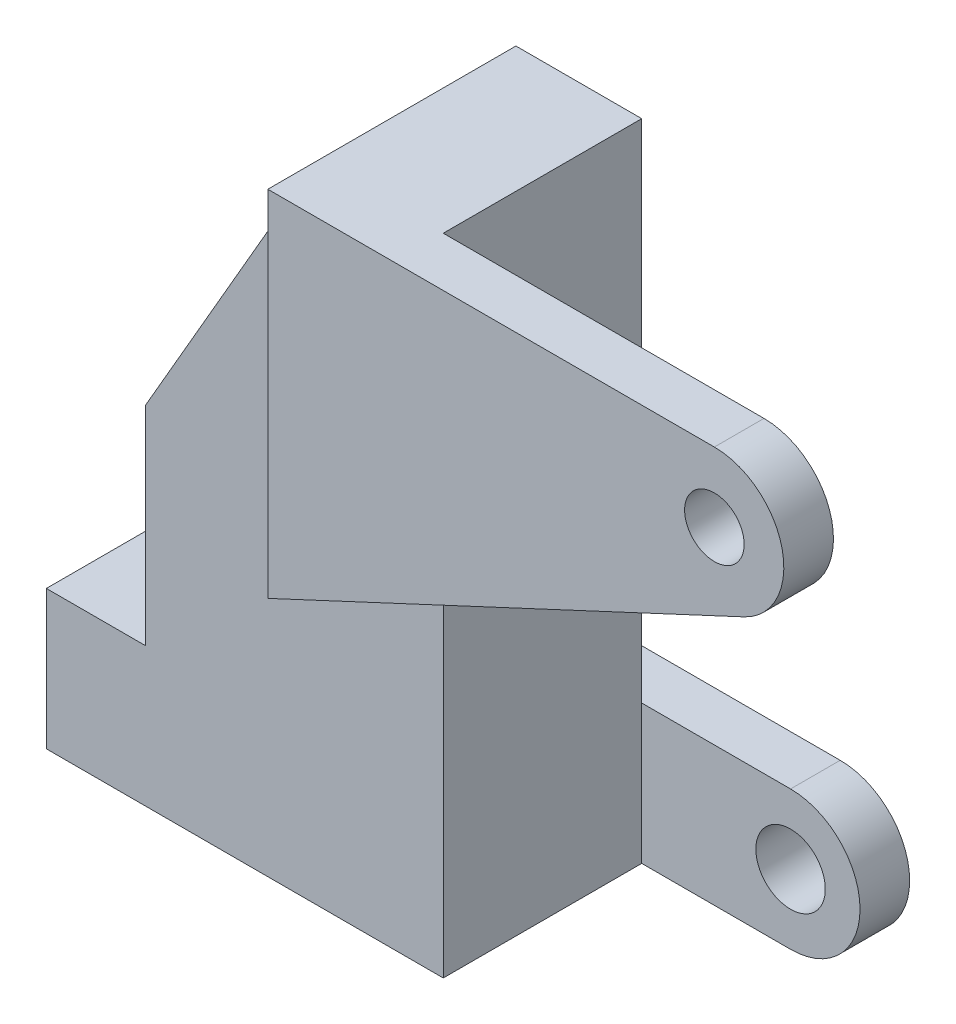
ISO-10303-21;
HEADER;
FILE_DESCRIPTION(('STEP AP214'),'2;1');
FILE_NAME('part.step','',(''),(''),'','','');
FILE_SCHEMA(('AUTOMOTIVE_DESIGN { 1 0 10303 214 1 1 1 1 }'));
ENDSEC;
DATA;
#1=APPLICATION_CONTEXT('core data for automotive mechanical design processes');
#2=APPLICATION_PROTOCOL_DEFINITION('international standard','automotive_design',2000,#1);
#3=PRODUCT_CONTEXT('',#1,'mechanical');
#4=PRODUCT('Part','Part','',(#3));
#5=PRODUCT_RELATED_PRODUCT_CATEGORY('part','',(#4));
#6=PRODUCT_DEFINITION_FORMATION('','',#4);
#7=PRODUCT_DEFINITION_CONTEXT('part definition',#1,'design');
#8=PRODUCT_DEFINITION('design','',#6,#7);
#9=PRODUCT_DEFINITION_SHAPE('','',#8);
#10=(LENGTH_UNIT() NAMED_UNIT(*) SI_UNIT(.MILLI.,.METRE.));
#11=(NAMED_UNIT(*) PLANE_ANGLE_UNIT() SI_UNIT($,.RADIAN.));
#12=(NAMED_UNIT(*) SI_UNIT($,.STERADIAN.) SOLID_ANGLE_UNIT());
#13=UNCERTAINTY_MEASURE_WITH_UNIT(LENGTH_MEASURE(1.E-05),#10,'distance_accuracy_value','');
#14=(GEOMETRIC_REPRESENTATION_CONTEXT(3) GLOBAL_UNCERTAINTY_ASSIGNED_CONTEXT((#13)) GLOBAL_UNIT_ASSIGNED_CONTEXT((#10,
#11,#12)) REPRESENTATION_CONTEXT('',''));
#15=CARTESIAN_POINT('',(0.,0.,0.));
#16=DIRECTION('',(0.,0.,1.));
#17=DIRECTION('',(1.,0.,0.));
#18=AXIS2_PLACEMENT_3D('',#15,#16,#17);
#19=CARTESIAN_POINT('',(0.,0.,0.));
#20=DIRECTION('',(0.,0.,-1.));
#21=DIRECTION('',(-1.,0.,0.));
#22=AXIS2_PLACEMENT_3D('',#19,#20,#21);
#23=PLANE('',#22);
#24=DIRECTION('',(1.,0.,0.));
#25=VECTOR('',#24,1.);
#26=CARTESIAN_POINT('',(55.,14.,0.));
#27=LINE('',#26,#25);
#28=CARTESIAN_POINT('',(10.,14.,0.));
#29=VERTEX_POINT('',#28);
#30=CARTESIAN_POINT('',(40.,14.,0.));
#31=VERTEX_POINT('',#30);
#32=EDGE_CURVE('E364',#29,#31,#27,.T.);
#33=ORIENTED_EDGE('',*,*,#32,.F.);
#34=DIRECTION('',(0.,-1.,0.));
#35=VECTOR('',#34,1.);
#36=CARTESIAN_POINT('',(10.,14.,0.));
#37=LINE('',#36,#35);
#38=CARTESIAN_POINT('',(10.,35.,0.));
#39=VERTEX_POINT('',#38);
#40=EDGE_CURVE('E280',#39,#29,#37,.T.);
#41=ORIENTED_EDGE('',*,*,#40,.F.);
#42=DIRECTION('',(-0.500000000000001,-0.866025403784438,0.));
#43=VECTOR('',#42,1.);
#44=CARTESIAN_POINT('',(10.,35.,0.));
#45=LINE('',#44,#43);
#46=CARTESIAN_POINT('',(27.3205080756888,65.,0.));
#47=VERTEX_POINT('',#46);
#48=EDGE_CURVE('E273',#47,#39,#45,.T.);
#49=ORIENTED_EDGE('',*,*,#48,.F.);
#50=DIRECTION('',(-1.,0.,0.));
#51=VECTOR('',#50,1.);
#52=CARTESIAN_POINT('',(27.3205080756888,65.,0.));
#53=LINE('',#52,#51);
#54=CARTESIAN_POINT('',(40.,65.,0.));
#55=VERTEX_POINT('',#54);
#56=EDGE_CURVE('E271',#55,#47,#53,.T.);
#57=ORIENTED_EDGE('',*,*,#56,.F.);
#58=DIRECTION('',(0.,1.,0.));
#59=VECTOR('',#58,1.);
#60=CARTESIAN_POINT('',(40.,65.,0.));
#61=LINE('',#60,#59);
#62=EDGE_CURVE('E62',#31,#55,#61,.T.);
#63=ORIENTED_EDGE('',*,*,#62,.F.);
#64=EDGE_LOOP('',(#33,#41,#49,#57,#63));
#65=FACE_BOUND('',#64,.T.);
#66=ADVANCED_FACE('F44',(#65),#23,.T.);
#67=CARTESIAN_POINT('',(0.,0.,20.));
#68=DIRECTION('',(0.,0.,-1.));
#69=DIRECTION('',(-1.,0.,0.));
#70=AXIS2_PLACEMENT_3D('',#67,#68,#69);
#71=PLANE('',#70);
#72=DIRECTION('',(0.906307787036648,0.422618261740704,0.));
#73=VECTOR('',#72,1.);
#74=CARTESIAN_POINT('',(27.3205080756888,29.2925099502873,20.));
#75=LINE('',#74,#73);
#76=CARTESIAN_POINT('',(27.3205080756888,29.2925099502873,20.));
#77=VERTEX_POINT('',#76);
#78=CARTESIAN_POINT('',(40.,35.2050541361082,20.));
#79=VERTEX_POINT('',#78);
#80=EDGE_CURVE('E222',#77,#79,#75,.T.);
#81=ORIENTED_EDGE('',*,*,#80,.F.);
#82=DIRECTION('',(0.,-1.,0.));
#83=VECTOR('',#82,1.);
#84=CARTESIAN_POINT('',(27.3205080756888,65.,20.));
#85=LINE('',#84,#83);
#86=CARTESIAN_POINT('',(27.3205080756888,65.,20.));
#87=VERTEX_POINT('',#86);
#88=EDGE_CURVE('E216',#87,#77,#85,.T.);
#89=ORIENTED_EDGE('',*,*,#88,.F.);
#90=DIRECTION('',(-0.500000000000001,-0.866025403784438,0.));
#91=VECTOR('',#90,1.);
#92=CARTESIAN_POINT('',(10.,35.,20.));
#93=LINE('',#92,#91);
#94=CARTESIAN_POINT('',(10.,35.,20.));
#95=VERTEX_POINT('',#94);
#96=EDGE_CURVE('E251',#87,#95,#93,.T.);
#97=ORIENTED_EDGE('',*,*,#96,.T.);
#98=DIRECTION('',(0.,-1.,0.));
#99=VECTOR('',#98,1.);
#100=CARTESIAN_POINT('',(10.,14.,20.));
#101=LINE('',#100,#99);
#102=CARTESIAN_POINT('',(10.,14.,20.));
#103=VERTEX_POINT('',#102);
#104=EDGE_CURVE('E258',#95,#103,#101,.T.);
#105=ORIENTED_EDGE('',*,*,#104,.T.);
#106=DIRECTION('',(-1.,0.,0.));
#107=VECTOR('',#106,1.);
#108=CARTESIAN_POINT('',(0.,14.,20.));
#109=LINE('',#108,#107);
#110=CARTESIAN_POINT('',(0.,14.,20.));
#111=VERTEX_POINT('',#110);
#112=EDGE_CURVE('E259',#103,#111,#109,.T.);
#113=ORIENTED_EDGE('',*,*,#112,.T.);
#114=DIRECTION('',(0.,-1.,0.));
#115=VECTOR('',#114,1.);
#116=CARTESIAN_POINT('',(0.,0.,20.));
#117=LINE('',#116,#115);
#118=CARTESIAN_POINT('',(0.,0.,20.));
#119=VERTEX_POINT('',#118);
#120=EDGE_CURVE('E265',#111,#119,#117,.T.);
#121=ORIENTED_EDGE('',*,*,#120,.T.);
#122=DIRECTION('',(1.,0.,0.));
#123=VECTOR('',#122,1.);
#124=CARTESIAN_POINT('',(40.,0.,20.));
#125=LINE('',#124,#123);
#126=CARTESIAN_POINT('',(40.,0.,20.));
#127=VERTEX_POINT('',#126);
#128=EDGE_CURVE('E244',#119,#127,#125,.T.);
#129=ORIENTED_EDGE('',*,*,#128,.T.);
#130=DIRECTION('',(0.,1.,0.));
#131=VECTOR('',#130,1.);
#132=CARTESIAN_POINT('',(40.,65.,20.));
#133=LINE('',#132,#131);
#134=EDGE_CURVE('E246',#127,#79,#133,.T.);
#135=ORIENTED_EDGE('',*,*,#134,.T.);
#136=EDGE_LOOP('',(#81,#89,#97,#105,#113,#121,#129,#135));
#137=FACE_BOUND('',#136,.T.);
#138=ADVANCED_FACE('F322',(#137),#71,.F.);
#139=CARTESIAN_POINT('',(40.,0.,20.));
#140=DIRECTION('',(0.,1.,0.));
#141=DIRECTION('',(-1.,0.,0.));
#142=AXIS2_PLACEMENT_3D('',#139,#140,#141);
#143=PLANE('',#142);
#144=DIRECTION('',(1.,0.,0.));
#145=VECTOR('',#144,1.);
#146=CARTESIAN_POINT('',(40.,0.,0.));
#147=LINE('',#146,#145);
#148=CARTESIAN_POINT('',(0.,0.,0.));
#149=VERTEX_POINT('',#148);
#150=CARTESIAN_POINT('',(10.,0.,0.));
#151=VERTEX_POINT('',#150);
#152=EDGE_CURVE('E245',#149,#151,#147,.T.);
#153=ORIENTED_EDGE('',*,*,#152,.T.);
#154=DIRECTION('',(0.,0.,1.));
#155=VECTOR('',#154,1.);
#156=CARTESIAN_POINT('',(10.,0.,-5.));
#157=LINE('',#156,#155);
#158=CARTESIAN_POINT('',(10.,0.,-5.));
#159=VERTEX_POINT('',#158);
#160=EDGE_CURVE('E188',#159,#151,#157,.T.);
#161=ORIENTED_EDGE('',*,*,#160,.F.);
#162=DIRECTION('',(-1.,0.,0.));
#163=VECTOR('',#162,1.);
#164=CARTESIAN_POINT('',(10.,0.,-5.));
#165=LINE('',#164,#163);
#166=CARTESIAN_POINT('',(55.,0.,-5.));
#167=VERTEX_POINT('',#166);
#168=EDGE_CURVE('E163',#167,#159,#165,.T.);
#169=ORIENTED_EDGE('',*,*,#168,.F.);
#170=DIRECTION('',(0.,0.,1.));
#171=VECTOR('',#170,1.);
#172=CARTESIAN_POINT('',(55.,0.,-5.));
#173=LINE('',#172,#171);
#174=CARTESIAN_POINT('',(55.,0.,0.));
#175=VERTEX_POINT('',#174);
#176=EDGE_CURVE('E159',#167,#175,#173,.T.);
#177=ORIENTED_EDGE('',*,*,#176,.T.);
#178=DIRECTION('',(-1.,0.,0.));
#179=VECTOR('',#178,1.);
#180=CARTESIAN_POINT('',(10.,0.,0.));
#181=LINE('',#180,#179);
#182=CARTESIAN_POINT('',(40.,0.,0.));
#183=VERTEX_POINT('',#182);
#184=EDGE_CURVE('E359',#175,#183,#181,.T.);
#185=ORIENTED_EDGE('',*,*,#184,.T.);
#186=DIRECTION('',(0.,0.,-1.));
#187=VECTOR('',#186,1.);
#188=CARTESIAN_POINT('',(40.,0.,20.));
#189=LINE('',#188,#187);
#190=EDGE_CURVE('E11',#127,#183,#189,.T.);
#191=ORIENTED_EDGE('',*,*,#190,.F.);
#192=ORIENTED_EDGE('',*,*,#128,.F.);
#193=DIRECTION('',(0.,0.,-1.));
#194=VECTOR('',#193,1.);
#195=CARTESIAN_POINT('',(0.,0.,20.));
#196=LINE('',#195,#194);
#197=EDGE_CURVE('E264',#119,#149,#196,.T.);
#198=ORIENTED_EDGE('',*,*,#197,.T.);
#199=EDGE_LOOP('',(#153,#161,#169,#177,#185,#191,#192,#198));
#200=FACE_BOUND('',#199,.T.);
#201=ADVANCED_FACE('F50',(#200),#143,.F.);
#202=CARTESIAN_POINT('',(40.,65.,20.));
#203=DIRECTION('',(-1.,0.,0.));
#204=DIRECTION('',(0.,-1.,0.));
#205=AXIS2_PLACEMENT_3D('',#202,#203,#204);
#206=PLANE('',#205);
#207=EDGE_CURVE('E268',#183,#31,#61,.T.);
#208=ORIENTED_EDGE('',*,*,#207,.T.);
#209=ORIENTED_EDGE('',*,*,#62,.T.);
#210=DIRECTION('',(0.,0.,-1.));
#211=VECTOR('',#210,1.);
#212=CARTESIAN_POINT('',(40.,65.,20.));
#213=LINE('',#212,#211);
#214=CARTESIAN_POINT('',(40.,65.,20.));
#215=VERTEX_POINT('',#214);
#216=EDGE_CURVE('E53',#215,#55,#213,.T.);
#217=ORIENTED_EDGE('',*,*,#216,.F.);
#218=EDGE_CURVE('E250',#79,#215,#133,.T.);
#219=ORIENTED_EDGE('',*,*,#218,.F.);
#220=ORIENTED_EDGE('',*,*,#134,.F.);
#221=ORIENTED_EDGE('',*,*,#190,.T.);
#222=EDGE_LOOP('',(#208,#209,#217,#219,#220,#221));
#223=FACE_BOUND('',#222,.T.);
#224=ADVANCED_FACE('F352',(#223),#206,.F.);
#225=CARTESIAN_POINT('',(27.3205080756888,65.,20.));
#226=DIRECTION('',(0.,-1.,0.));
#227=DIRECTION('',(0.,0.,-1.));
#228=AXIS2_PLACEMENT_3D('',#225,#226,#227);
#229=PLANE('',#228);
#230=ORIENTED_EDGE('',*,*,#56,.T.);
#231=DIRECTION('',(0.,0.,-1.));
#232=VECTOR('',#231,1.);
#233=CARTESIAN_POINT('',(27.3205080756888,65.,20.));
#234=LINE('',#233,#232);
#235=EDGE_CURVE('E302',#87,#47,#234,.T.);
#236=ORIENTED_EDGE('',*,*,#235,.F.);
#237=DIRECTION('',(0.,0.,-1.));
#238=VECTOR('',#237,1.);
#239=CARTESIAN_POINT('',(27.3205080756888,65.,25.));
#240=LINE('',#239,#238);
#241=CARTESIAN_POINT('',(27.3205080756888,65.,25.));
#242=VERTEX_POINT('',#241);
#243=EDGE_CURVE('E236',#242,#87,#240,.T.);
#244=ORIENTED_EDGE('',*,*,#243,.F.);
#245=DIRECTION('',(-1.,0.,0.));
#246=VECTOR('',#245,1.);
#247=CARTESIAN_POINT('',(72.3205080756888,65.,25.));
#248=LINE('',#247,#246);
#249=CARTESIAN_POINT('',(72.3205080756888,65.,25.));
#250=VERTEX_POINT('',#249);
#251=EDGE_CURVE('E196',#250,#242,#248,.T.);
#252=ORIENTED_EDGE('',*,*,#251,.F.);
#253=DIRECTION('',(0.,0.,-1.));
#254=VECTOR('',#253,1.);
#255=CARTESIAN_POINT('',(72.3205080756888,65.,25.));
#256=LINE('',#255,#254);
#257=CARTESIAN_POINT('',(72.3205080756888,65.,20.));
#258=VERTEX_POINT('',#257);
#259=EDGE_CURVE('E215',#250,#258,#256,.T.);
#260=ORIENTED_EDGE('',*,*,#259,.T.);
#261=DIRECTION('',(-1.,0.,0.));
#262=VECTOR('',#261,1.);
#263=CARTESIAN_POINT('',(72.3205080756888,65.,20.));
#264=LINE('',#263,#262);
#265=EDGE_CURVE('E198',#258,#215,#264,.T.);
#266=ORIENTED_EDGE('',*,*,#265,.T.);
#267=ORIENTED_EDGE('',*,*,#216,.T.);
#268=EDGE_LOOP('',(#230,#236,#244,#252,#260,#266,#267));
#269=FACE_BOUND('',#268,.T.);
#270=ADVANCED_FACE('F307',(#269),#229,.F.);
#271=CARTESIAN_POINT('',(10.,35.,20.));
#272=DIRECTION('',(0.866025403784438,-0.500000000000001,0.));
#273=DIRECTION('',(0.500000000000001,0.866025403784438,0.));
#274=AXIS2_PLACEMENT_3D('',#271,#272,#273);
#275=PLANE('',#274);
#276=ORIENTED_EDGE('',*,*,#48,.T.);
#277=DIRECTION('',(0.,0.,-1.));
#278=VECTOR('',#277,1.);
#279=CARTESIAN_POINT('',(10.,35.,20.));
#280=LINE('',#279,#278);
#281=EDGE_CURVE('E300',#95,#39,#280,.T.);
#282=ORIENTED_EDGE('',*,*,#281,.F.);
#283=ORIENTED_EDGE('',*,*,#96,.F.);
#284=ORIENTED_EDGE('',*,*,#235,.T.);
#285=EDGE_LOOP('',(#276,#282,#283,#284));
#286=FACE_BOUND('',#285,.T.);
#287=ADVANCED_FACE('F316',(#286),#275,.F.);
#288=CARTESIAN_POINT('',(10.,14.,20.));
#289=DIRECTION('',(1.,0.,0.));
#290=DIRECTION('',(0.,1.,0.));
#291=AXIS2_PLACEMENT_3D('',#288,#289,#290);
#292=PLANE('',#291);
#293=ORIENTED_EDGE('',*,*,#40,.T.);
#294=DIRECTION('',(0.,0.,-1.));
#295=VECTOR('',#294,1.);
#296=CARTESIAN_POINT('',(10.,14.,20.));
#297=LINE('',#296,#295);
#298=EDGE_CURVE('E291',#103,#29,#297,.T.);
#299=ORIENTED_EDGE('',*,*,#298,.F.);
#300=ORIENTED_EDGE('',*,*,#104,.F.);
#301=ORIENTED_EDGE('',*,*,#281,.T.);
#302=EDGE_LOOP('',(#293,#299,#300,#301));
#303=FACE_BOUND('',#302,.T.);
#304=ADVANCED_FACE('F319',(#303),#292,.F.);
#305=CARTESIAN_POINT('',(0.,14.,20.));
#306=DIRECTION('',(0.,-1.,0.));
#307=DIRECTION('',(0.,0.,-1.));
#308=AXIS2_PLACEMENT_3D('',#305,#306,#307);
#309=PLANE('',#308);
#310=DIRECTION('',(-1.,0.,0.));
#311=VECTOR('',#310,1.);
#312=CARTESIAN_POINT('',(0.,14.,0.));
#313=LINE('',#312,#311);
#314=CARTESIAN_POINT('',(0.,14.,0.));
#315=VERTEX_POINT('',#314);
#316=EDGE_CURVE('E282',#29,#315,#313,.T.);
#317=ORIENTED_EDGE('',*,*,#316,.T.);
#318=DIRECTION('',(0.,0.,-1.));
#319=VECTOR('',#318,1.);
#320=CARTESIAN_POINT('',(0.,14.,20.));
#321=LINE('',#320,#319);
#322=EDGE_CURVE('E286',#111,#315,#321,.T.);
#323=ORIENTED_EDGE('',*,*,#322,.F.);
#324=ORIENTED_EDGE('',*,*,#112,.F.);
#325=ORIENTED_EDGE('',*,*,#298,.T.);
#326=EDGE_LOOP('',(#317,#323,#324,#325));
#327=FACE_BOUND('',#326,.T.);
#328=ADVANCED_FACE('F382',(#327),#309,.F.);
#329=CARTESIAN_POINT('',(0.,0.,20.));
#330=DIRECTION('',(1.,0.,0.));
#331=DIRECTION('',(0.,0.,-1.));
#332=AXIS2_PLACEMENT_3D('',#329,#330,#331);
#333=PLANE('',#332);
#334=DIRECTION('',(0.,-1.,0.));
#335=VECTOR('',#334,1.);
#336=CARTESIAN_POINT('',(0.,0.,0.));
#337=LINE('',#336,#335);
#338=EDGE_CURVE('E249',#315,#149,#337,.T.);
#339=ORIENTED_EDGE('',*,*,#338,.T.);
#340=ORIENTED_EDGE('',*,*,#197,.F.);
#341=ORIENTED_EDGE('',*,*,#120,.F.);
#342=ORIENTED_EDGE('',*,*,#322,.T.);
#343=EDGE_LOOP('',(#339,#340,#341,#342));
#344=FACE_BOUND('',#343,.T.);
#345=ADVANCED_FACE('F379',(#344),#333,.F.);
#346=DIRECTION('',(0.,1.,0.));
#347=VECTOR('',#346,1.);
#348=CARTESIAN_POINT('',(10.,14.,0.));
#349=LINE('',#348,#347);
#350=EDGE_CURVE('E66',#151,#29,#349,.T.);
#351=ORIENTED_EDGE('',*,*,#350,.F.);
#352=ORIENTED_EDGE('',*,*,#152,.F.);
#353=ORIENTED_EDGE('',*,*,#338,.F.);
#354=ORIENTED_EDGE('',*,*,#316,.F.);
#355=EDGE_LOOP('',(#351,#352,#353,#354));
#356=FACE_BOUND('',#355,.T.);
#357=ADVANCED_FACE('F378',(#356),#23,.T.);
#358=CARTESIAN_POINT('',(72.3205080756888,58.,20.));
#359=DIRECTION('',(0.,0.,1.));
#360=DIRECTION('',(1.,0.,0.));
#361=AXIS2_PLACEMENT_3D('',#358,#359,#360);
#362=PLANE('',#361);
#363=CARTESIAN_POINT('',(72.3205080756888,58.,20.));
#364=DIRECTION('',(0.,0.,1.));
#365=DIRECTION('',(1.,0.,0.));
#366=AXIS2_PLACEMENT_3D('',#363,#364,#365);
#367=CIRCLE('',#366,3.00000000000001);
#368=CARTESIAN_POINT('',(75.3205080756888,58.,20.));
#369=VERTEX_POINT('',#368);
#370=EDGE_CURVE('E181',#369,#369,#367,.T.);
#371=ORIENTED_EDGE('',*,*,#370,.T.);
#372=EDGE_LOOP('',(#371));
#373=FACE_BOUND('',#372,.T.);
#374=CARTESIAN_POINT('',(75.2788359078738,51.6558454907435,20.));
#375=VERTEX_POINT('',#374);
#376=EDGE_CURVE('E219',#79,#375,#75,.T.);
#377=ORIENTED_EDGE('',*,*,#376,.F.);
#378=ORIENTED_EDGE('',*,*,#218,.T.);
#379=ORIENTED_EDGE('',*,*,#265,.F.);
#380=CARTESIAN_POINT('',(72.3205080756888,58.,20.));
#381=DIRECTION('',(0.,0.,1.));
#382=DIRECTION('',(1.,0.,0.));
#383=AXIS2_PLACEMENT_3D('',#380,#381,#382);
#384=CIRCLE('',#383,6.99999999999999);
#385=EDGE_CURVE('E201',#375,#258,#384,.T.);
#386=ORIENTED_EDGE('',*,*,#385,.F.);
#387=EDGE_LOOP('',(#377,#378,#379,#386));
#388=FACE_BOUND('',#387,.T.);
#389=ADVANCED_FACE('F344',(#373,#388),#362,.F.);
#390=CARTESIAN_POINT('',(72.3205080756888,58.,25.));
#391=DIRECTION('',(0.,0.,1.));
#392=DIRECTION('',(1.,0.,0.));
#393=AXIS2_PLACEMENT_3D('',#390,#391,#392);
#394=PLANE('',#393);
#395=ORIENTED_EDGE('',*,*,#251,.T.);
#396=DIRECTION('',(0.,-1.,0.));
#397=VECTOR('',#396,1.);
#398=CARTESIAN_POINT('',(27.3205080756888,65.,25.));
#399=LINE('',#398,#397);
#400=CARTESIAN_POINT('',(27.3205080756888,29.2925099502873,25.));
#401=VERTEX_POINT('',#400);
#402=EDGE_CURVE('E205',#242,#401,#399,.T.);
#403=ORIENTED_EDGE('',*,*,#402,.T.);
#404=DIRECTION('',(0.906307787036648,0.422618261740704,0.));
#405=VECTOR('',#404,1.);
#406=CARTESIAN_POINT('',(27.3205080756888,29.2925099502873,25.));
#407=LINE('',#406,#405);
#408=CARTESIAN_POINT('',(75.2788359078738,51.6558454907435,25.));
#409=VERTEX_POINT('',#408);
#410=EDGE_CURVE('E206',#401,#409,#407,.T.);
#411=ORIENTED_EDGE('',*,*,#410,.T.);
#412=CARTESIAN_POINT('',(72.3205080756888,58.,25.));
#413=DIRECTION('',(0.,0.,1.));
#414=DIRECTION('',(1.,0.,0.));
#415=AXIS2_PLACEMENT_3D('',#412,#413,#414);
#416=CIRCLE('',#415,6.99999999999999);
#417=EDGE_CURVE('E207',#409,#250,#416,.T.);
#418=ORIENTED_EDGE('',*,*,#417,.T.);
#419=EDGE_LOOP('',(#395,#403,#411,#418));
#420=FACE_BOUND('',#419,.T.);
#421=CARTESIAN_POINT('',(72.3205080756888,58.,25.));
#422=DIRECTION('',(0.,0.,1.));
#423=DIRECTION('',(1.,0.,0.));
#424=AXIS2_PLACEMENT_3D('',#421,#422,#423);
#425=CIRCLE('',#424,3.00000000000001);
#426=CARTESIAN_POINT('',(75.3205080756888,58.,25.));
#427=VERTEX_POINT('',#426);
#428=EDGE_CURVE('E189',#427,#427,#425,.T.);
#429=ORIENTED_EDGE('',*,*,#428,.F.);
#430=EDGE_LOOP('',(#429));
#431=FACE_BOUND('',#430,.T.);
#432=ADVANCED_FACE('F334',(#420,#431),#394,.T.);
#433=CARTESIAN_POINT('',(27.3205080756888,65.,25.));
#434=DIRECTION('',(1.,0.,0.));
#435=DIRECTION('',(0.,1.,0.));
#436=AXIS2_PLACEMENT_3D('',#433,#434,#435);
#437=PLANE('',#436);
#438=ORIENTED_EDGE('',*,*,#88,.T.);
#439=DIRECTION('',(0.,0.,-1.));
#440=VECTOR('',#439,1.);
#441=CARTESIAN_POINT('',(27.3205080756888,29.2925099502873,25.));
#442=LINE('',#441,#440);
#443=EDGE_CURVE('E231',#401,#77,#442,.T.);
#444=ORIENTED_EDGE('',*,*,#443,.F.);
#445=ORIENTED_EDGE('',*,*,#402,.F.);
#446=ORIENTED_EDGE('',*,*,#243,.T.);
#447=EDGE_LOOP('',(#438,#444,#445,#446));
#448=FACE_BOUND('',#447,.T.);
#449=ADVANCED_FACE('F327',(#448),#437,.F.);
#450=CARTESIAN_POINT('',(27.3205080756888,29.2925099502873,25.));
#451=DIRECTION('',(-0.422618261740704,0.906307787036648,0.));
#452=DIRECTION('',(-0.906307787036648,-0.422618261740704,0.));
#453=AXIS2_PLACEMENT_3D('',#450,#451,#452);
#454=PLANE('',#453);
#455=ORIENTED_EDGE('',*,*,#80,.T.);
#456=ORIENTED_EDGE('',*,*,#376,.T.);
#457=DIRECTION('',(0.,0.,-1.));
#458=VECTOR('',#457,1.);
#459=CARTESIAN_POINT('',(75.2788359078738,51.6558454907435,25.));
#460=LINE('',#459,#458);
#461=EDGE_CURVE('E228',#409,#375,#460,.T.);
#462=ORIENTED_EDGE('',*,*,#461,.F.);
#463=ORIENTED_EDGE('',*,*,#410,.F.);
#464=ORIENTED_EDGE('',*,*,#443,.T.);
#465=EDGE_LOOP('',(#455,#456,#462,#463,#464));
#466=FACE_BOUND('',#465,.T.);
#467=ADVANCED_FACE('F346',(#466),#454,.F.);
#468=CARTESIAN_POINT('',(72.3205080756888,58.,25.));
#469=DIRECTION('',(0.,0.,-1.));
#470=DIRECTION('',(-1.,0.,0.));
#471=AXIS2_PLACEMENT_3D('',#468,#469,#470);
#472=CYLINDRICAL_SURFACE('',#471,6.99999999999999);
#473=ORIENTED_EDGE('',*,*,#385,.T.);
#474=ORIENTED_EDGE('',*,*,#259,.F.);
#475=ORIENTED_EDGE('',*,*,#417,.F.);
#476=ORIENTED_EDGE('',*,*,#461,.T.);
#477=EDGE_LOOP('',(#473,#474,#475,#476));
#478=FACE_BOUND('',#477,.T.);
#479=ADVANCED_FACE('F336',(#478),#472,.T.);
#480=CARTESIAN_POINT('',(72.3205080756888,58.,25.));
#481=DIRECTION('',(0.,0.,-1.));
#482=DIRECTION('',(-1.,0.,0.));
#483=AXIS2_PLACEMENT_3D('',#480,#481,#482);
#484=CYLINDRICAL_SURFACE('',#483,3.00000000000001);
#485=ORIENTED_EDGE('',*,*,#428,.T.);
#486=EDGE_LOOP('',(#485));
#487=FACE_BOUND('',#486,.T.);
#488=ORIENTED_EDGE('',*,*,#370,.F.);
#489=EDGE_LOOP('',(#488));
#490=FACE_BOUND('',#489,.T.);
#491=ADVANCED_FACE('F417',(#487,#490),#484,.F.);
#492=CARTESIAN_POINT('',(55.,7.,0.));
#493=DIRECTION('',(0.,0.,1.));
#494=DIRECTION('',(1.,0.,0.));
#495=AXIS2_PLACEMENT_3D('',#492,#493,#494);
#496=PLANE('',#495);
#497=CARTESIAN_POINT('',(55.,7.,0.));
#498=DIRECTION('',(0.,0.,-1.));
#499=DIRECTION('',(-1.,0.,0.));
#500=AXIS2_PLACEMENT_3D('',#497,#498,#499);
#501=CIRCLE('',#500,3.50000000000001);
#502=CARTESIAN_POINT('',(51.5,7.,0.));
#503=VERTEX_POINT('',#502);
#504=EDGE_CURVE('E514',#503,#503,#501,.T.);
#505=ORIENTED_EDGE('',*,*,#504,.T.);
#506=EDGE_LOOP('',(#505));
#507=FACE_BOUND('',#506,.T.);
#508=ORIENTED_EDGE('',*,*,#207,.F.);
#509=ORIENTED_EDGE('',*,*,#184,.F.);
#510=CARTESIAN_POINT('',(55.,7.,0.));
#511=DIRECTION('',(0.,0.,-1.));
#512=DIRECTION('',(1.,0.,0.));
#513=AXIS2_PLACEMENT_3D('',#510,#511,#512);
#514=CIRCLE('',#513,7.);
#515=CARTESIAN_POINT('',(55.,14.,0.));
#516=VERTEX_POINT('',#515);
#517=EDGE_CURVE('E358',#516,#175,#514,.T.);
#518=ORIENTED_EDGE('',*,*,#517,.F.);
#519=EDGE_CURVE('E178',#31,#516,#27,.T.);
#520=ORIENTED_EDGE('',*,*,#519,.F.);
#521=EDGE_LOOP('',(#508,#509,#518,#520));
#522=FACE_BOUND('',#521,.T.);
#523=ADVANCED_FACE('F360',(#507,#522),#496,.T.);
#524=CARTESIAN_POINT('',(55.,7.,-5.));
#525=DIRECTION('',(0.,0.,1.));
#526=DIRECTION('',(1.,0.,0.));
#527=AXIS2_PLACEMENT_3D('',#524,#525,#526);
#528=PLANE('',#527);
#529=DIRECTION('',(1.,0.,0.));
#530=VECTOR('',#529,1.);
#531=CARTESIAN_POINT('',(55.,14.,-5.));
#532=LINE('',#531,#530);
#533=CARTESIAN_POINT('',(10.,14.,-5.));
#534=VERTEX_POINT('',#533);
#535=CARTESIAN_POINT('',(55.,14.,-5.));
#536=VERTEX_POINT('',#535);
#537=EDGE_CURVE('E164',#534,#536,#532,.T.);
#538=ORIENTED_EDGE('',*,*,#537,.T.);
#539=CARTESIAN_POINT('',(55.,7.,-5.));
#540=DIRECTION('',(0.,0.,-1.));
#541=DIRECTION('',(1.,0.,0.));
#542=AXIS2_PLACEMENT_3D('',#539,#540,#541);
#543=CIRCLE('',#542,7.);
#544=EDGE_CURVE('E152',#536,#167,#543,.T.);
#545=ORIENTED_EDGE('',*,*,#544,.T.);
#546=ORIENTED_EDGE('',*,*,#168,.T.);
#547=DIRECTION('',(0.,1.,0.));
#548=VECTOR('',#547,1.);
#549=CARTESIAN_POINT('',(10.,14.,-5.));
#550=LINE('',#549,#548);
#551=EDGE_CURVE('E172',#159,#534,#550,.T.);
#552=ORIENTED_EDGE('',*,*,#551,.T.);
#553=EDGE_LOOP('',(#538,#545,#546,#552));
#554=FACE_BOUND('',#553,.T.);
#555=CARTESIAN_POINT('',(55.,7.,-5.));
#556=DIRECTION('',(0.,0.,-1.));
#557=DIRECTION('',(-1.,0.,0.));
#558=AXIS2_PLACEMENT_3D('',#555,#556,#557);
#559=CIRCLE('',#558,3.50000000000001);
#560=CARTESIAN_POINT('',(51.5,7.,-5.));
#561=VERTEX_POINT('',#560);
#562=EDGE_CURVE('E512',#561,#561,#559,.T.);
#563=ORIENTED_EDGE('',*,*,#562,.F.);
#564=EDGE_LOOP('',(#563));
#565=FACE_BOUND('',#564,.T.);
#566=ADVANCED_FACE('F169',(#554,#565),#528,.F.);
#567=CARTESIAN_POINT('',(55.,14.,-5.));
#568=DIRECTION('',(0.,-1.,0.));
#569=DIRECTION('',(1.,0.,0.));
#570=AXIS2_PLACEMENT_3D('',#567,#568,#569);
#571=PLANE('',#570);
#572=ORIENTED_EDGE('',*,*,#32,.T.);
#573=ORIENTED_EDGE('',*,*,#519,.T.);
#574=DIRECTION('',(0.,0.,1.));
#575=VECTOR('',#574,1.);
#576=CARTESIAN_POINT('',(55.,14.,-5.));
#577=LINE('',#576,#575);
#578=EDGE_CURVE('E158',#536,#516,#577,.T.);
#579=ORIENTED_EDGE('',*,*,#578,.F.);
#580=ORIENTED_EDGE('',*,*,#537,.F.);
#581=DIRECTION('',(0.,0.,1.));
#582=VECTOR('',#581,1.);
#583=CARTESIAN_POINT('',(10.,14.,-5.));
#584=LINE('',#583,#582);
#585=EDGE_CURVE('E369',#534,#29,#584,.T.);
#586=ORIENTED_EDGE('',*,*,#585,.T.);
#587=EDGE_LOOP('',(#572,#573,#579,#580,#586));
#588=FACE_BOUND('',#587,.T.);
#589=ADVANCED_FACE('F179',(#588),#571,.F.);
#590=CARTESIAN_POINT('',(55.,7.,-5.));
#591=DIRECTION('',(0.,0.,1.));
#592=DIRECTION('',(1.,0.,0.));
#593=AXIS2_PLACEMENT_3D('',#590,#591,#592);
#594=CYLINDRICAL_SURFACE('',#593,7.);
#595=ORIENTED_EDGE('',*,*,#517,.T.);
#596=ORIENTED_EDGE('',*,*,#176,.F.);
#597=ORIENTED_EDGE('',*,*,#544,.F.);
#598=ORIENTED_EDGE('',*,*,#578,.T.);
#599=EDGE_LOOP('',(#595,#596,#597,#598));
#600=FACE_BOUND('',#599,.T.);
#601=ADVANCED_FACE('F156',(#600),#594,.T.);
#602=CARTESIAN_POINT('',(10.,14.,-5.));
#603=DIRECTION('',(1.,0.,0.));
#604=DIRECTION('',(0.,0.,-1.));
#605=AXIS2_PLACEMENT_3D('',#602,#603,#604);
#606=PLANE('',#605);
#607=ORIENTED_EDGE('',*,*,#350,.T.);
#608=ORIENTED_EDGE('',*,*,#585,.F.);
#609=ORIENTED_EDGE('',*,*,#551,.F.);
#610=ORIENTED_EDGE('',*,*,#160,.T.);
#611=EDGE_LOOP('',(#607,#608,#609,#610));
#612=FACE_BOUND('',#611,.T.);
#613=ADVANCED_FACE('F374',(#612),#606,.F.);
#614=CARTESIAN_POINT('',(55.,7.,-5.));
#615=DIRECTION('',(0.,0.,1.));
#616=DIRECTION('',(1.,0.,0.));
#617=AXIS2_PLACEMENT_3D('',#614,#615,#616);
#618=CYLINDRICAL_SURFACE('',#617,3.50000000000001);
#619=ORIENTED_EDGE('',*,*,#562,.T.);
#620=EDGE_LOOP('',(#619));
#621=FACE_BOUND('',#620,.T.);
#622=ORIENTED_EDGE('',*,*,#504,.F.);
#623=EDGE_LOOP('',(#622));
#624=FACE_BOUND('',#623,.T.);
#625=ADVANCED_FACE('F497',(#621,#624),#618,.F.);
#626=CLOSED_SHELL('',(#66,#138,#201,#224,#270,#287,#304,#328,#345,#357,#389,#432,#449,#467,#479,
#491,#523,#566,#589,#601,#613,#625));
#627=MANIFOLD_SOLID_BREP('B2',#626);
#628=ADVANCED_BREP_SHAPE_REPRESENTATION('',(#18,#627),#14);
#629=SHAPE_DEFINITION_REPRESENTATION(#9,#628);
ENDSEC;
END-ISO-10303-21;
